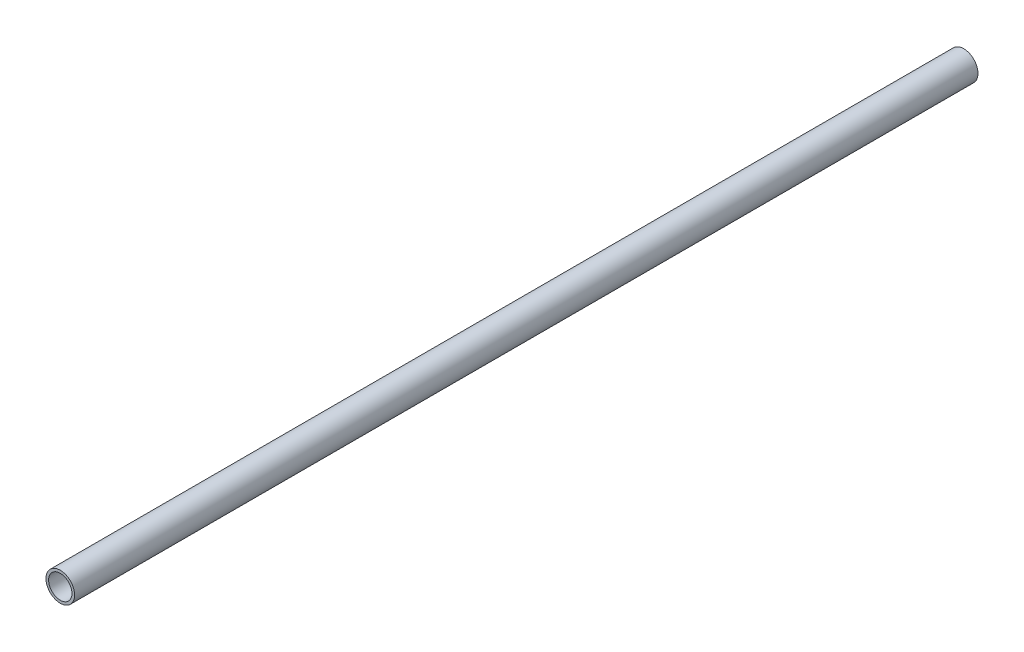
ISO-10303-21;
HEADER;
FILE_DESCRIPTION(('STEP AP214'),'2;1');
FILE_NAME('part.step','',(''),(''),'','','');
FILE_SCHEMA(('AUTOMOTIVE_DESIGN { 1 0 10303 214 1 1 1 1 }'));
ENDSEC;
DATA;
#1=APPLICATION_CONTEXT('core data for automotive mechanical design processes');
#2=APPLICATION_PROTOCOL_DEFINITION('international standard','automotive_design',2000,#1);
#3=PRODUCT_CONTEXT('',#1,'mechanical');
#4=PRODUCT('Part','Part','',(#3));
#5=PRODUCT_RELATED_PRODUCT_CATEGORY('part','',(#4));
#6=PRODUCT_DEFINITION_FORMATION('','',#4);
#7=PRODUCT_DEFINITION_CONTEXT('part definition',#1,'design');
#8=PRODUCT_DEFINITION('design','',#6,#7);
#9=PRODUCT_DEFINITION_SHAPE('','',#8);
#10=(LENGTH_UNIT() NAMED_UNIT(*) SI_UNIT(.MILLI.,.METRE.));
#11=(NAMED_UNIT(*) PLANE_ANGLE_UNIT() SI_UNIT($,.RADIAN.));
#12=(NAMED_UNIT(*) SI_UNIT($,.STERADIAN.) SOLID_ANGLE_UNIT());
#13=UNCERTAINTY_MEASURE_WITH_UNIT(LENGTH_MEASURE(1.E-05),#10,'distance_accuracy_value','');
#14=(GEOMETRIC_REPRESENTATION_CONTEXT(3) GLOBAL_UNCERTAINTY_ASSIGNED_CONTEXT((#13)) GLOBAL_UNIT_ASSIGNED_CONTEXT((#10,
#11,#12)) REPRESENTATION_CONTEXT('',''));
#15=CARTESIAN_POINT('',(0.,0.,0.));
#16=DIRECTION('',(0.,0.,1.));
#17=DIRECTION('',(1.,0.,0.));
#18=AXIS2_PLACEMENT_3D('',#15,#16,#17);
#19=CARTESIAN_POINT('',(0.,0.,445.));
#20=DIRECTION('',(0.,0.,1.));
#21=DIRECTION('',(1.,0.,0.));
#22=AXIS2_PLACEMENT_3D('',#19,#20,#21);
#23=PLANE('',#22);
#24=CARTESIAN_POINT('',(0.,0.,445.));
#25=DIRECTION('',(0.,0.,1.));
#26=DIRECTION('',(1.,0.,0.));
#27=AXIS2_PLACEMENT_3D('',#24,#25,#26);
#28=CIRCLE('',#27,14.1);
#29=CARTESIAN_POINT('',(14.1,0.,445.));
#30=VERTEX_POINT('',#29);
#31=EDGE_CURVE('E12',#30,#30,#28,.T.);
#32=ORIENTED_EDGE('',*,*,#31,.T.);
#33=EDGE_LOOP('',(#32));
#34=FACE_BOUND('',#33,.T.);
#35=CARTESIAN_POINT('',(0.,0.,445.));
#36=DIRECTION('',(0.,0.,1.));
#37=DIRECTION('',(1.,0.,0.));
#38=AXIS2_PLACEMENT_3D('',#35,#36,#37);
#39=CIRCLE('',#38,11.5);
#40=CARTESIAN_POINT('',(11.5,0.,445.));
#41=VERTEX_POINT('',#40);
#42=EDGE_CURVE('E53',#41,#41,#39,.T.);
#43=ORIENTED_EDGE('',*,*,#42,.F.);
#44=EDGE_LOOP('',(#43));
#45=FACE_BOUND('',#44,.T.);
#46=ADVANCED_FACE('F42',(#34,#45),#23,.T.);
#47=CARTESIAN_POINT('',(0.,0.,-445.));
#48=DIRECTION('',(0.,0.,1.));
#49=DIRECTION('',(1.,0.,0.));
#50=AXIS2_PLACEMENT_3D('',#47,#48,#49);
#51=PLANE('',#50);
#52=CARTESIAN_POINT('',(0.,0.,-445.));
#53=DIRECTION('',(0.,0.,1.));
#54=DIRECTION('',(1.,0.,0.));
#55=AXIS2_PLACEMENT_3D('',#52,#53,#54);
#56=CIRCLE('',#55,14.1);
#57=CARTESIAN_POINT('',(14.1,0.,-445.));
#58=VERTEX_POINT('',#57);
#59=EDGE_CURVE('E46',#58,#58,#56,.T.);
#60=ORIENTED_EDGE('',*,*,#59,.F.);
#61=EDGE_LOOP('',(#60));
#62=FACE_BOUND('',#61,.T.);
#63=CARTESIAN_POINT('',(0.,0.,-445.));
#64=DIRECTION('',(0.,0.,1.));
#65=DIRECTION('',(1.,0.,0.));
#66=AXIS2_PLACEMENT_3D('',#63,#64,#65);
#67=CIRCLE('',#66,11.5);
#68=CARTESIAN_POINT('',(11.5,0.,-445.));
#69=VERTEX_POINT('',#68);
#70=EDGE_CURVE('E55',#69,#69,#67,.T.);
#71=ORIENTED_EDGE('',*,*,#70,.T.);
#72=EDGE_LOOP('',(#71));
#73=FACE_BOUND('',#72,.T.);
#74=ADVANCED_FACE('F65',(#62,#73),#51,.F.);
#75=CARTESIAN_POINT('',(0.,0.,445.));
#76=DIRECTION('',(0.,0.,-1.));
#77=DIRECTION('',(-1.,0.,0.));
#78=AXIS2_PLACEMENT_3D('',#75,#76,#77);
#79=CYLINDRICAL_SURFACE('',#78,14.1);
#80=ORIENTED_EDGE('',*,*,#31,.F.);
#81=EDGE_LOOP('',(#80));
#82=FACE_BOUND('',#81,.T.);
#83=ORIENTED_EDGE('',*,*,#59,.T.);
#84=EDGE_LOOP('',(#83));
#85=FACE_BOUND('',#84,.T.);
#86=ADVANCED_FACE('F44',(#82,#85),#79,.T.);
#87=CARTESIAN_POINT('',(0.,0.,445.));
#88=DIRECTION('',(0.,0.,-1.));
#89=DIRECTION('',(-1.,0.,0.));
#90=AXIS2_PLACEMENT_3D('',#87,#88,#89);
#91=CYLINDRICAL_SURFACE('',#90,11.5);
#92=ORIENTED_EDGE('',*,*,#42,.T.);
#93=EDGE_LOOP('',(#92));
#94=FACE_BOUND('',#93,.T.);
#95=ORIENTED_EDGE('',*,*,#70,.F.);
#96=EDGE_LOOP('',(#95));
#97=FACE_BOUND('',#96,.T.);
#98=ADVANCED_FACE('F61',(#94,#97),#91,.F.);
#99=CLOSED_SHELL('',(#46,#74,#86,#98));
#100=MANIFOLD_SOLID_BREP('B2',#99);
#101=ADVANCED_BREP_SHAPE_REPRESENTATION('',(#18,#100),#14);
#102=SHAPE_DEFINITION_REPRESENTATION(#9,#101);
ENDSEC;
END-ISO-10303-21;
